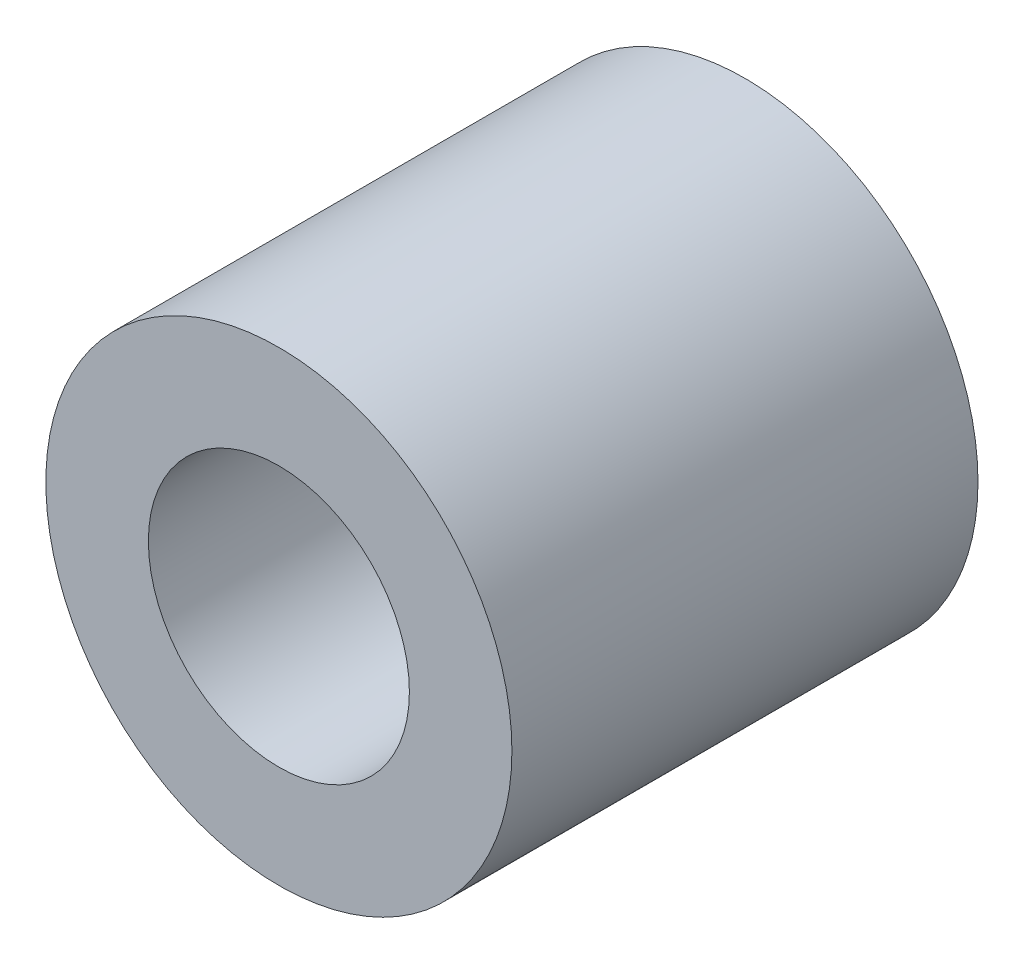
ISO-10303-21;
HEADER;
FILE_DESCRIPTION(('STEP AP214'),'2;1');
FILE_NAME('part.step','',(''),(''),'','','');
FILE_SCHEMA(('AUTOMOTIVE_DESIGN { 1 0 10303 214 1 1 1 1 }'));
ENDSEC;
DATA;
#1=APPLICATION_CONTEXT('core data for automotive mechanical design processes');
#2=APPLICATION_PROTOCOL_DEFINITION('international standard','automotive_design',2000,#1);
#3=PRODUCT_CONTEXT('',#1,'mechanical');
#4=PRODUCT('Part','Part','',(#3));
#5=PRODUCT_RELATED_PRODUCT_CATEGORY('part','',(#4));
#6=PRODUCT_DEFINITION_FORMATION('','',#4);
#7=PRODUCT_DEFINITION_CONTEXT('part definition',#1,'design');
#8=PRODUCT_DEFINITION('design','',#6,#7);
#9=PRODUCT_DEFINITION_SHAPE('','',#8);
#10=(LENGTH_UNIT() NAMED_UNIT(*) SI_UNIT(.MILLI.,.METRE.));
#11=(NAMED_UNIT(*) PLANE_ANGLE_UNIT() SI_UNIT($,.RADIAN.));
#12=(NAMED_UNIT(*) SI_UNIT($,.STERADIAN.) SOLID_ANGLE_UNIT());
#13=UNCERTAINTY_MEASURE_WITH_UNIT(LENGTH_MEASURE(1.E-05),#10,'distance_accuracy_value','');
#14=(GEOMETRIC_REPRESENTATION_CONTEXT(3) GLOBAL_UNCERTAINTY_ASSIGNED_CONTEXT((#13)) GLOBAL_UNIT_ASSIGNED_CONTEXT((#10,
#11,#12)) REPRESENTATION_CONTEXT('',''));
#15=CARTESIAN_POINT('',(0.,0.,0.));
#16=DIRECTION('',(0.,0.,1.));
#17=DIRECTION('',(1.,0.,0.));
#18=AXIS2_PLACEMENT_3D('',#15,#16,#17);
#19=CARTESIAN_POINT('',(0.,0.,3.175));
#20=DIRECTION('',(0.,0.,1.));
#21=DIRECTION('',(1.,0.,0.));
#22=AXIS2_PLACEMENT_3D('',#19,#20,#21);
#23=PLANE('',#22);
#24=CARTESIAN_POINT('',(0.,0.,3.175));
#25=DIRECTION('',(0.,0.,1.));
#26=DIRECTION('',(1.,0.,0.));
#27=AXIS2_PLACEMENT_3D('',#24,#25,#26);
#28=CIRCLE('',#27,3.175);
#29=CARTESIAN_POINT('',(3.175,0.,3.175));
#30=VERTEX_POINT('',#29);
#31=EDGE_CURVE('E10',#30,#30,#28,.T.);
#32=ORIENTED_EDGE('',*,*,#31,.T.);
#33=EDGE_LOOP('',(#32));
#34=FACE_BOUND('',#33,.T.);
#35=CARTESIAN_POINT('',(0.,0.,3.175));
#36=DIRECTION('',(0.,0.,1.));
#37=DIRECTION('',(1.,0.,0.));
#38=AXIS2_PLACEMENT_3D('',#35,#36,#37);
#39=CIRCLE('',#38,1.778);
#40=CARTESIAN_POINT('',(1.778,0.,3.175));
#41=VERTEX_POINT('',#40);
#42=EDGE_CURVE('E49',#41,#41,#39,.T.);
#43=ORIENTED_EDGE('',*,*,#42,.F.);
#44=EDGE_LOOP('',(#43));
#45=FACE_BOUND('',#44,.T.);
#46=ADVANCED_FACE('F34',(#34,#45),#23,.T.);
#47=CARTESIAN_POINT('',(0.,0.,-3.175));
#48=DIRECTION('',(0.,0.,1.));
#49=DIRECTION('',(1.,0.,0.));
#50=AXIS2_PLACEMENT_3D('',#47,#48,#49);
#51=PLANE('',#50);
#52=CARTESIAN_POINT('',(0.,0.,-3.175));
#53=DIRECTION('',(0.,0.,1.));
#54=DIRECTION('',(1.,0.,0.));
#55=AXIS2_PLACEMENT_3D('',#52,#53,#54);
#56=CIRCLE('',#55,3.175);
#57=CARTESIAN_POINT('',(3.175,0.,-3.175));
#58=VERTEX_POINT('',#57);
#59=EDGE_CURVE('E38',#58,#58,#56,.T.);
#60=ORIENTED_EDGE('',*,*,#59,.F.);
#61=EDGE_LOOP('',(#60));
#62=FACE_BOUND('',#61,.T.);
#63=CARTESIAN_POINT('',(0.,0.,-3.175));
#64=DIRECTION('',(0.,0.,1.));
#65=DIRECTION('',(1.,0.,0.));
#66=AXIS2_PLACEMENT_3D('',#63,#64,#65);
#67=CIRCLE('',#66,1.778);
#68=CARTESIAN_POINT('',(1.778,0.,-3.175));
#69=VERTEX_POINT('',#68);
#70=EDGE_CURVE('E51',#69,#69,#67,.T.);
#71=ORIENTED_EDGE('',*,*,#70,.T.);
#72=EDGE_LOOP('',(#71));
#73=FACE_BOUND('',#72,.T.);
#74=ADVANCED_FACE('F61',(#62,#73),#51,.F.);
#75=CARTESIAN_POINT('',(0.,0.,3.175));
#76=DIRECTION('',(0.,0.,-1.));
#77=DIRECTION('',(-1.,0.,0.));
#78=AXIS2_PLACEMENT_3D('',#75,#76,#77);
#79=CYLINDRICAL_SURFACE('',#78,3.175);
#80=ORIENTED_EDGE('',*,*,#31,.F.);
#81=EDGE_LOOP('',(#80));
#82=FACE_BOUND('',#81,.T.);
#83=ORIENTED_EDGE('',*,*,#59,.T.);
#84=EDGE_LOOP('',(#83));
#85=FACE_BOUND('',#84,.T.);
#86=ADVANCED_FACE('F36',(#82,#85),#79,.T.);
#87=CARTESIAN_POINT('',(0.,0.,3.175));
#88=DIRECTION('',(0.,0.,-1.));
#89=DIRECTION('',(-1.,0.,0.));
#90=AXIS2_PLACEMENT_3D('',#87,#88,#89);
#91=CYLINDRICAL_SURFACE('',#90,1.778);
#92=ORIENTED_EDGE('',*,*,#42,.T.);
#93=EDGE_LOOP('',(#92));
#94=FACE_BOUND('',#93,.T.);
#95=ORIENTED_EDGE('',*,*,#70,.F.);
#96=EDGE_LOOP('',(#95));
#97=FACE_BOUND('',#96,.T.);
#98=ADVANCED_FACE('F57',(#94,#97),#91,.F.);
#99=CLOSED_SHELL('',(#46,#74,#86,#98));
#100=MANIFOLD_SOLID_BREP('B2',#99);
#101=ADVANCED_BREP_SHAPE_REPRESENTATION('',(#18,#100),#14);
#102=SHAPE_DEFINITION_REPRESENTATION(#9,#101);
ENDSEC;
END-ISO-10303-21;
